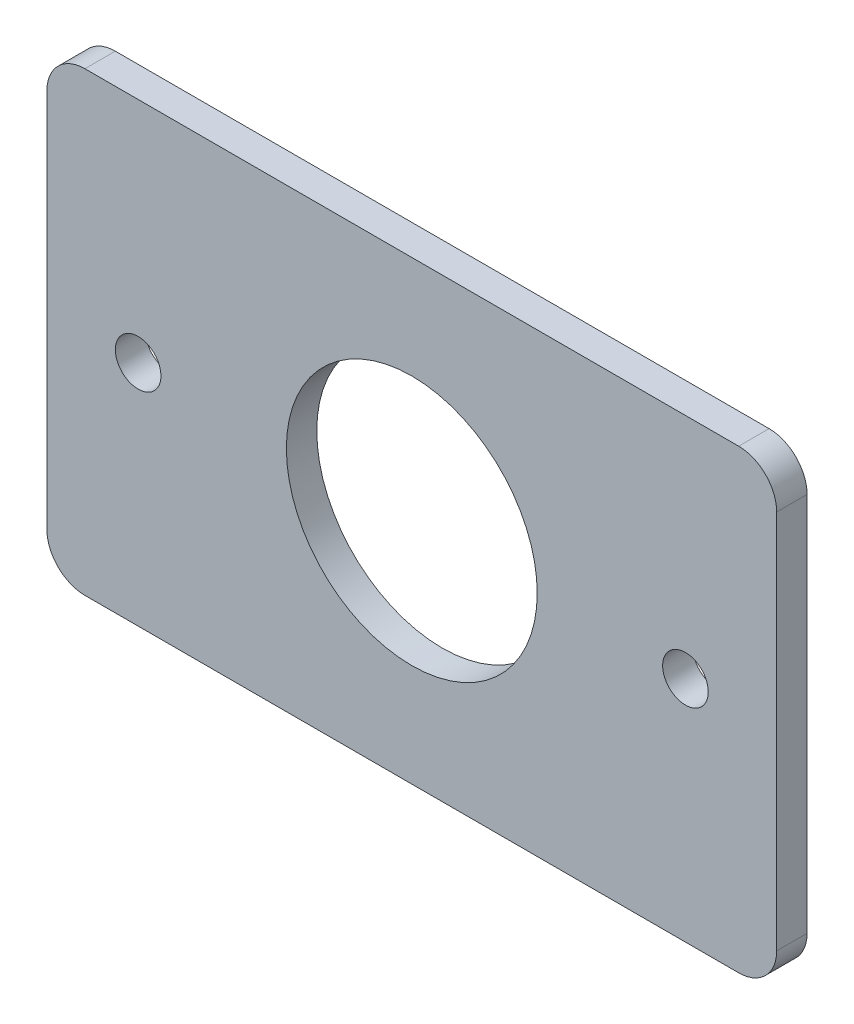
ISO-10303-21;
HEADER;
FILE_DESCRIPTION(('STEP AP214'),'2;1');
FILE_NAME('part.step','',(''),(''),'','','');
FILE_SCHEMA(('AUTOMOTIVE_DESIGN { 1 0 10303 214 1 1 1 1 }'));
ENDSEC;
DATA;
#1=APPLICATION_CONTEXT('core data for automotive mechanical design processes');
#2=APPLICATION_PROTOCOL_DEFINITION('international standard','automotive_design',2000,#1);
#3=PRODUCT_CONTEXT('',#1,'mechanical');
#4=PRODUCT('Part','Part','',(#3));
#5=PRODUCT_RELATED_PRODUCT_CATEGORY('part','',(#4));
#6=PRODUCT_DEFINITION_FORMATION('','',#4);
#7=PRODUCT_DEFINITION_CONTEXT('part definition',#1,'design');
#8=PRODUCT_DEFINITION('design','',#6,#7);
#9=PRODUCT_DEFINITION_SHAPE('','',#8);
#10=(LENGTH_UNIT() NAMED_UNIT(*) SI_UNIT(.MILLI.,.METRE.));
#11=(NAMED_UNIT(*) PLANE_ANGLE_UNIT() SI_UNIT($,.RADIAN.));
#12=(NAMED_UNIT(*) SI_UNIT($,.STERADIAN.) SOLID_ANGLE_UNIT());
#13=UNCERTAINTY_MEASURE_WITH_UNIT(LENGTH_MEASURE(1.E-05),#10,'distance_accuracy_value','');
#14=(GEOMETRIC_REPRESENTATION_CONTEXT(3) GLOBAL_UNCERTAINTY_ASSIGNED_CONTEXT((#13)) GLOBAL_UNIT_ASSIGNED_CONTEXT((#10,
#11,#12)) REPRESENTATION_CONTEXT('',''));
#15=CARTESIAN_POINT('',(0.,0.,0.));
#16=DIRECTION('',(0.,0.,1.));
#17=DIRECTION('',(1.,0.,0.));
#18=AXIS2_PLACEMENT_3D('',#15,#16,#17);
#19=CARTESIAN_POINT('',(-21.5,2.5,2.));
#20=DIRECTION('',(0.,0.,1.));
#21=DIRECTION('',(1.,0.,0.));
#22=AXIS2_PLACEMENT_3D('',#19,#20,#21);
#23=PLANE('',#22);
#24=CARTESIAN_POINT('',(-18.,15.,2.));
#25=DIRECTION('',(0.,0.,1.));
#26=DIRECTION('',(-1.,0.,0.));
#27=AXIS2_PLACEMENT_3D('',#24,#25,#26);
#28=CIRCLE('',#27,1.5);
#29=CARTESIAN_POINT('',(-19.5,15.,2.));
#30=VERTEX_POINT('',#29);
#31=EDGE_CURVE('E182',#30,#30,#28,.T.);
#32=ORIENTED_EDGE('',*,*,#31,.F.);
#33=EDGE_LOOP('',(#32));
#34=FACE_BOUND('',#33,.T.);
#35=CARTESIAN_POINT('',(-21.5,2.5,2.));
#36=DIRECTION('',(0.,0.,1.));
#37=DIRECTION('',(1.,0.,0.));
#38=AXIS2_PLACEMENT_3D('',#35,#36,#37);
#39=CIRCLE('',#38,2.5);
#40=CARTESIAN_POINT('',(-24.,2.5,2.));
#41=VERTEX_POINT('',#40);
#42=CARTESIAN_POINT('',(-21.5,0.,2.));
#43=VERTEX_POINT('',#42);
#44=EDGE_CURVE('E145',#41,#43,#39,.T.);
#45=ORIENTED_EDGE('',*,*,#44,.T.);
#46=DIRECTION('',(1.,0.,0.));
#47=VECTOR('',#46,1.);
#48=CARTESIAN_POINT('',(-21.5,0.,2.));
#49=LINE('',#48,#47);
#50=CARTESIAN_POINT('',(21.5,0.,2.));
#51=VERTEX_POINT('',#50);
#52=EDGE_CURVE('E93',#43,#51,#49,.T.);
#53=ORIENTED_EDGE('',*,*,#52,.T.);
#54=CARTESIAN_POINT('',(21.5,2.5,2.));
#55=DIRECTION('',(0.,0.,1.));
#56=DIRECTION('',(1.,0.,0.));
#57=AXIS2_PLACEMENT_3D('',#54,#55,#56);
#58=CIRCLE('',#57,2.5);
#59=CARTESIAN_POINT('',(24.,2.5,2.));
#60=VERTEX_POINT('',#59);
#61=EDGE_CURVE('E160',#51,#60,#58,.T.);
#62=ORIENTED_EDGE('',*,*,#61,.T.);
#63=DIRECTION('',(0.,1.,0.));
#64=VECTOR('',#63,1.);
#65=CARTESIAN_POINT('',(24.,27.5,2.));
#66=LINE('',#65,#64);
#67=CARTESIAN_POINT('',(24.,27.5,2.));
#68=VERTEX_POINT('',#67);
#69=EDGE_CURVE('E173',#60,#68,#66,.T.);
#70=ORIENTED_EDGE('',*,*,#69,.T.);
#71=CARTESIAN_POINT('',(21.5,27.5,2.));
#72=DIRECTION('',(0.,0.,1.));
#73=DIRECTION('',(1.,0.,0.));
#74=AXIS2_PLACEMENT_3D('',#71,#72,#73);
#75=CIRCLE('',#74,2.5);
#76=CARTESIAN_POINT('',(21.5,30.,2.));
#77=VERTEX_POINT('',#76);
#78=EDGE_CURVE('E112',#68,#77,#75,.T.);
#79=ORIENTED_EDGE('',*,*,#78,.T.);
#80=DIRECTION('',(-1.,0.,0.));
#81=VECTOR('',#80,1.);
#82=CARTESIAN_POINT('',(-21.5,30.,2.));
#83=LINE('',#82,#81);
#84=CARTESIAN_POINT('',(-21.5,30.,2.));
#85=VERTEX_POINT('',#84);
#86=EDGE_CURVE('E106',#77,#85,#83,.T.);
#87=ORIENTED_EDGE('',*,*,#86,.T.);
#88=CARTESIAN_POINT('',(-21.5,27.5,2.));
#89=DIRECTION('',(0.,0.,1.));
#90=DIRECTION('',(1.,0.,0.));
#91=AXIS2_PLACEMENT_3D('',#88,#89,#90);
#92=CIRCLE('',#91,2.5);
#93=CARTESIAN_POINT('',(-24.,27.5,2.));
#94=VERTEX_POINT('',#93);
#95=EDGE_CURVE('E110',#85,#94,#92,.T.);
#96=ORIENTED_EDGE('',*,*,#95,.T.);
#97=DIRECTION('',(0.,-1.,0.));
#98=VECTOR('',#97,1.);
#99=CARTESIAN_POINT('',(-24.,27.5,2.));
#100=LINE('',#99,#98);
#101=EDGE_CURVE('E50',#94,#41,#100,.T.);
#102=ORIENTED_EDGE('',*,*,#101,.T.);
#103=EDGE_LOOP('',(#45,#53,#62,#70,#79,#87,#96,#102));
#104=FACE_BOUND('',#103,.T.);
#105=CARTESIAN_POINT('',(18.,15.,2.));
#106=DIRECTION('',(0.,0.,1.));
#107=DIRECTION('',(1.,0.,0.));
#108=AXIS2_PLACEMENT_3D('',#105,#106,#107);
#109=CIRCLE('',#108,1.5);
#110=CARTESIAN_POINT('',(19.5,15.,2.));
#111=VERTEX_POINT('',#110);
#112=EDGE_CURVE('E134',#111,#111,#109,.T.);
#113=ORIENTED_EDGE('',*,*,#112,.F.);
#114=EDGE_LOOP('',(#113));
#115=FACE_BOUND('',#114,.T.);
#116=CARTESIAN_POINT('',(0.,15.,2.));
#117=DIRECTION('',(0.,0.,1.));
#118=DIRECTION('',(1.,0.,0.));
#119=AXIS2_PLACEMENT_3D('',#116,#117,#118);
#120=CIRCLE('',#119,8.25);
#121=CARTESIAN_POINT('',(8.25,15.,2.));
#122=VERTEX_POINT('',#121);
#123=EDGE_CURVE('E188',#122,#122,#120,.T.);
#124=ORIENTED_EDGE('',*,*,#123,.F.);
#125=EDGE_LOOP('',(#124));
#126=FACE_BOUND('',#125,.T.);
#127=ADVANCED_FACE('F33',(#34,#104,#115,#126),#23,.T.);
#128=CARTESIAN_POINT('',(-21.5,2.5,0.));
#129=DIRECTION('',(0.,0.,1.));
#130=DIRECTION('',(1.,0.,0.));
#131=AXIS2_PLACEMENT_3D('',#128,#129,#130);
#132=PLANE('',#131);
#133=CARTESIAN_POINT('',(-21.5,2.5,0.));
#134=DIRECTION('',(0.,0.,1.));
#135=DIRECTION('',(1.,0.,0.));
#136=AXIS2_PLACEMENT_3D('',#133,#134,#135);
#137=CIRCLE('',#136,2.5);
#138=CARTESIAN_POINT('',(-24.,2.5,0.));
#139=VERTEX_POINT('',#138);
#140=CARTESIAN_POINT('',(-21.5,0.,0.));
#141=VERTEX_POINT('',#140);
#142=EDGE_CURVE('E130',#139,#141,#137,.T.);
#143=ORIENTED_EDGE('',*,*,#142,.F.);
#144=DIRECTION('',(0.,-1.,0.));
#145=VECTOR('',#144,1.);
#146=CARTESIAN_POINT('',(-24.,27.5,0.));
#147=LINE('',#146,#145);
#148=CARTESIAN_POINT('',(-24.,27.5,0.));
#149=VERTEX_POINT('',#148);
#150=EDGE_CURVE('E85',#149,#139,#147,.T.);
#151=ORIENTED_EDGE('',*,*,#150,.F.);
#152=CARTESIAN_POINT('',(-21.5,27.5,0.));
#153=DIRECTION('',(0.,0.,1.));
#154=DIRECTION('',(1.,0.,0.));
#155=AXIS2_PLACEMENT_3D('',#152,#153,#154);
#156=CIRCLE('',#155,2.5);
#157=CARTESIAN_POINT('',(-21.5,30.,0.));
#158=VERTEX_POINT('',#157);
#159=EDGE_CURVE('E79',#158,#149,#156,.T.);
#160=ORIENTED_EDGE('',*,*,#159,.F.);
#161=DIRECTION('',(-1.,0.,0.));
#162=VECTOR('',#161,1.);
#163=CARTESIAN_POINT('',(-21.5,30.,0.));
#164=LINE('',#163,#162);
#165=CARTESIAN_POINT('',(21.5,30.,0.));
#166=VERTEX_POINT('',#165);
#167=EDGE_CURVE('E120',#166,#158,#164,.T.);
#168=ORIENTED_EDGE('',*,*,#167,.F.);
#169=CARTESIAN_POINT('',(21.5,27.5,0.));
#170=DIRECTION('',(0.,0.,1.));
#171=DIRECTION('',(1.,0.,0.));
#172=AXIS2_PLACEMENT_3D('',#169,#170,#171);
#173=CIRCLE('',#172,2.5);
#174=CARTESIAN_POINT('',(24.,27.5,0.));
#175=VERTEX_POINT('',#174);
#176=EDGE_CURVE('E140',#175,#166,#173,.T.);
#177=ORIENTED_EDGE('',*,*,#176,.F.);
#178=DIRECTION('',(0.,1.,0.));
#179=VECTOR('',#178,1.);
#180=CARTESIAN_POINT('',(24.,27.5,0.));
#181=LINE('',#180,#179);
#182=CARTESIAN_POINT('',(24.,2.5,0.));
#183=VERTEX_POINT('',#182);
#184=EDGE_CURVE('E138',#183,#175,#181,.T.);
#185=ORIENTED_EDGE('',*,*,#184,.F.);
#186=CARTESIAN_POINT('',(21.5,2.5,0.));
#187=DIRECTION('',(0.,0.,1.));
#188=DIRECTION('',(1.,0.,0.));
#189=AXIS2_PLACEMENT_3D('',#186,#187,#188);
#190=CIRCLE('',#189,2.5);
#191=CARTESIAN_POINT('',(21.5,0.,0.));
#192=VERTEX_POINT('',#191);
#193=EDGE_CURVE('E136',#192,#183,#190,.T.);
#194=ORIENTED_EDGE('',*,*,#193,.F.);
#195=DIRECTION('',(1.,0.,0.));
#196=VECTOR('',#195,1.);
#197=CARTESIAN_POINT('',(-21.5,0.,0.));
#198=LINE('',#197,#196);
#199=EDGE_CURVE('E133',#141,#192,#198,.T.);
#200=ORIENTED_EDGE('',*,*,#199,.F.);
#201=EDGE_LOOP('',(#143,#151,#160,#168,#177,#185,#194,#200));
#202=FACE_BOUND('',#201,.T.);
#203=CARTESIAN_POINT('',(18.,15.,0.));
#204=DIRECTION('',(0.,0.,1.));
#205=DIRECTION('',(1.,0.,0.));
#206=AXIS2_PLACEMENT_3D('',#203,#204,#205);
#207=CIRCLE('',#206,1.5);
#208=CARTESIAN_POINT('',(19.5,15.,0.));
#209=VERTEX_POINT('',#208);
#210=EDGE_CURVE('E179',#209,#209,#207,.T.);
#211=ORIENTED_EDGE('',*,*,#210,.T.);
#212=EDGE_LOOP('',(#211));
#213=FACE_BOUND('',#212,.T.);
#214=CARTESIAN_POINT('',(-18.,15.,0.));
#215=DIRECTION('',(0.,0.,1.));
#216=DIRECTION('',(-1.,0.,0.));
#217=AXIS2_PLACEMENT_3D('',#214,#215,#216);
#218=CIRCLE('',#217,1.5);
#219=CARTESIAN_POINT('',(-19.5,15.,0.));
#220=VERTEX_POINT('',#219);
#221=EDGE_CURVE('E185',#220,#220,#218,.T.);
#222=ORIENTED_EDGE('',*,*,#221,.T.);
#223=EDGE_LOOP('',(#222));
#224=FACE_BOUND('',#223,.T.);
#225=CARTESIAN_POINT('',(0.,15.,0.));
#226=DIRECTION('',(0.,0.,1.));
#227=DIRECTION('',(1.,0.,0.));
#228=AXIS2_PLACEMENT_3D('',#225,#226,#227);
#229=CIRCLE('',#228,8.25);
#230=CARTESIAN_POINT('',(8.25,15.,0.));
#231=VERTEX_POINT('',#230);
#232=EDGE_CURVE('E191',#231,#231,#229,.T.);
#233=ORIENTED_EDGE('',*,*,#232,.T.);
#234=EDGE_LOOP('',(#233));
#235=FACE_BOUND('',#234,.T.);
#236=ADVANCED_FACE('F164',(#202,#213,#224,#235),#132,.F.);
#237=CARTESIAN_POINT('',(-21.5,2.5,2.));
#238=DIRECTION('',(0.,0.,-1.));
#239=DIRECTION('',(-1.,0.,0.));
#240=AXIS2_PLACEMENT_3D('',#237,#238,#239);
#241=CYLINDRICAL_SURFACE('',#240,2.5);
#242=ORIENTED_EDGE('',*,*,#142,.T.);
#243=DIRECTION('',(0.,0.,-1.));
#244=VECTOR('',#243,1.);
#245=CARTESIAN_POINT('',(-21.5,0.,2.));
#246=LINE('',#245,#244);
#247=EDGE_CURVE('E11',#43,#141,#246,.T.);
#248=ORIENTED_EDGE('',*,*,#247,.F.);
#249=ORIENTED_EDGE('',*,*,#44,.F.);
#250=DIRECTION('',(0.,0.,-1.));
#251=VECTOR('',#250,1.);
#252=CARTESIAN_POINT('',(-24.,2.5,2.));
#253=LINE('',#252,#251);
#254=EDGE_CURVE('E126',#41,#139,#253,.T.);
#255=ORIENTED_EDGE('',*,*,#254,.T.);
#256=EDGE_LOOP('',(#242,#248,#249,#255));
#257=FACE_BOUND('',#256,.T.);
#258=ADVANCED_FACE('F35',(#257),#241,.T.);
#259=CARTESIAN_POINT('',(-21.5,0.,2.));
#260=DIRECTION('',(0.,1.,0.));
#261=DIRECTION('',(0.,0.,1.));
#262=AXIS2_PLACEMENT_3D('',#259,#260,#261);
#263=PLANE('',#262);
#264=ORIENTED_EDGE('',*,*,#199,.T.);
#265=DIRECTION('',(0.,0.,-1.));
#266=VECTOR('',#265,1.);
#267=CARTESIAN_POINT('',(21.5,0.,2.));
#268=LINE('',#267,#266);
#269=EDGE_CURVE('E42',#51,#192,#268,.T.);
#270=ORIENTED_EDGE('',*,*,#269,.F.);
#271=ORIENTED_EDGE('',*,*,#52,.F.);
#272=ORIENTED_EDGE('',*,*,#247,.T.);
#273=EDGE_LOOP('',(#264,#270,#271,#272));
#274=FACE_BOUND('',#273,.T.);
#275=ADVANCED_FACE('F224',(#274),#263,.F.);
#276=CARTESIAN_POINT('',(21.5,2.5,2.));
#277=DIRECTION('',(0.,0.,-1.));
#278=DIRECTION('',(-1.,0.,0.));
#279=AXIS2_PLACEMENT_3D('',#276,#277,#278);
#280=CYLINDRICAL_SURFACE('',#279,2.5);
#281=ORIENTED_EDGE('',*,*,#193,.T.);
#282=DIRECTION('',(0.,0.,-1.));
#283=VECTOR('',#282,1.);
#284=CARTESIAN_POINT('',(24.,2.5,2.));
#285=LINE('',#284,#283);
#286=EDGE_CURVE('E152',#60,#183,#285,.T.);
#287=ORIENTED_EDGE('',*,*,#286,.F.);
#288=ORIENTED_EDGE('',*,*,#61,.F.);
#289=ORIENTED_EDGE('',*,*,#269,.T.);
#290=EDGE_LOOP('',(#281,#287,#288,#289));
#291=FACE_BOUND('',#290,.T.);
#292=ADVANCED_FACE('F158',(#291),#280,.T.);
#293=CARTESIAN_POINT('',(24.,27.5,2.));
#294=DIRECTION('',(-1.,0.,0.));
#295=DIRECTION('',(0.,0.,1.));
#296=AXIS2_PLACEMENT_3D('',#293,#294,#295);
#297=PLANE('',#296);
#298=ORIENTED_EDGE('',*,*,#184,.T.);
#299=DIRECTION('',(0.,0.,-1.));
#300=VECTOR('',#299,1.);
#301=CARTESIAN_POINT('',(24.,27.5,2.));
#302=LINE('',#301,#300);
#303=EDGE_CURVE('E149',#68,#175,#302,.T.);
#304=ORIENTED_EDGE('',*,*,#303,.F.);
#305=ORIENTED_EDGE('',*,*,#69,.F.);
#306=ORIENTED_EDGE('',*,*,#286,.T.);
#307=EDGE_LOOP('',(#298,#304,#305,#306));
#308=FACE_BOUND('',#307,.T.);
#309=ADVANCED_FACE('F169',(#308),#297,.F.);
#310=CARTESIAN_POINT('',(21.5,27.5,2.));
#311=DIRECTION('',(0.,0.,-1.));
#312=DIRECTION('',(-1.,0.,0.));
#313=AXIS2_PLACEMENT_3D('',#310,#311,#312);
#314=CYLINDRICAL_SURFACE('',#313,2.5);
#315=ORIENTED_EDGE('',*,*,#176,.T.);
#316=DIRECTION('',(0.,0.,-1.));
#317=VECTOR('',#316,1.);
#318=CARTESIAN_POINT('',(21.5,30.,2.));
#319=LINE('',#318,#317);
#320=EDGE_CURVE('E121',#77,#166,#319,.T.);
#321=ORIENTED_EDGE('',*,*,#320,.F.);
#322=ORIENTED_EDGE('',*,*,#78,.F.);
#323=ORIENTED_EDGE('',*,*,#303,.T.);
#324=EDGE_LOOP('',(#315,#321,#322,#323));
#325=FACE_BOUND('',#324,.T.);
#326=ADVANCED_FACE('F172',(#325),#314,.T.);
#327=CARTESIAN_POINT('',(-21.5,30.,2.));
#328=DIRECTION('',(0.,-1.,0.));
#329=DIRECTION('',(0.,0.,-1.));
#330=AXIS2_PLACEMENT_3D('',#327,#328,#329);
#331=PLANE('',#330);
#332=ORIENTED_EDGE('',*,*,#167,.T.);
#333=DIRECTION('',(0.,0.,-1.));
#334=VECTOR('',#333,1.);
#335=CARTESIAN_POINT('',(-21.5,30.,2.));
#336=LINE('',#335,#334);
#337=EDGE_CURVE('E117',#85,#158,#336,.T.);
#338=ORIENTED_EDGE('',*,*,#337,.F.);
#339=ORIENTED_EDGE('',*,*,#86,.F.);
#340=ORIENTED_EDGE('',*,*,#320,.T.);
#341=EDGE_LOOP('',(#332,#338,#339,#340));
#342=FACE_BOUND('',#341,.T.);
#343=ADVANCED_FACE('F118',(#342),#331,.F.);
#344=CARTESIAN_POINT('',(-21.5,27.5,2.));
#345=DIRECTION('',(0.,0.,-1.));
#346=DIRECTION('',(-1.,0.,0.));
#347=AXIS2_PLACEMENT_3D('',#344,#345,#346);
#348=CYLINDRICAL_SURFACE('',#347,2.5);
#349=ORIENTED_EDGE('',*,*,#159,.T.);
#350=DIRECTION('',(0.,0.,-1.));
#351=VECTOR('',#350,1.);
#352=CARTESIAN_POINT('',(-24.,27.5,2.));
#353=LINE('',#352,#351);
#354=EDGE_CURVE('E122',#94,#149,#353,.T.);
#355=ORIENTED_EDGE('',*,*,#354,.F.);
#356=ORIENTED_EDGE('',*,*,#95,.F.);
#357=ORIENTED_EDGE('',*,*,#337,.T.);
#358=EDGE_LOOP('',(#349,#355,#356,#357));
#359=FACE_BOUND('',#358,.T.);
#360=ADVANCED_FACE('F124',(#359),#348,.T.);
#361=CARTESIAN_POINT('',(-24.,27.5,2.));
#362=DIRECTION('',(1.,0.,0.));
#363=DIRECTION('',(0.,0.,-1.));
#364=AXIS2_PLACEMENT_3D('',#361,#362,#363);
#365=PLANE('',#364);
#366=ORIENTED_EDGE('',*,*,#150,.T.);
#367=ORIENTED_EDGE('',*,*,#254,.F.);
#368=ORIENTED_EDGE('',*,*,#101,.F.);
#369=ORIENTED_EDGE('',*,*,#354,.T.);
#370=EDGE_LOOP('',(#366,#367,#368,#369));
#371=FACE_BOUND('',#370,.T.);
#372=ADVANCED_FACE('F212',(#371),#365,.F.);
#373=CARTESIAN_POINT('',(18.,15.,2.));
#374=DIRECTION('',(0.,0.,-1.));
#375=DIRECTION('',(-1.,0.,0.));
#376=AXIS2_PLACEMENT_3D('',#373,#374,#375);
#377=CYLINDRICAL_SURFACE('',#376,1.5);
#378=ORIENTED_EDGE('',*,*,#112,.T.);
#379=EDGE_LOOP('',(#378));
#380=FACE_BOUND('',#379,.T.);
#381=ORIENTED_EDGE('',*,*,#210,.F.);
#382=EDGE_LOOP('',(#381));
#383=FACE_BOUND('',#382,.T.);
#384=ADVANCED_FACE('F209',(#380,#383),#377,.F.);
#385=CARTESIAN_POINT('',(-18.,15.,2.));
#386=DIRECTION('',(0.,0.,-1.));
#387=DIRECTION('',(-1.,0.,0.));
#388=AXIS2_PLACEMENT_3D('',#385,#386,#387);
#389=CYLINDRICAL_SURFACE('',#388,1.5);
#390=ORIENTED_EDGE('',*,*,#31,.T.);
#391=EDGE_LOOP('',(#390));
#392=FACE_BOUND('',#391,.T.);
#393=ORIENTED_EDGE('',*,*,#221,.F.);
#394=EDGE_LOOP('',(#393));
#395=FACE_BOUND('',#394,.T.);
#396=ADVANCED_FACE('F288',(#392,#395),#389,.F.);
#397=CARTESIAN_POINT('',(0.,15.,2.));
#398=DIRECTION('',(0.,0.,-1.));
#399=DIRECTION('',(-1.,0.,0.));
#400=AXIS2_PLACEMENT_3D('',#397,#398,#399);
#401=CYLINDRICAL_SURFACE('',#400,8.25);
#402=ORIENTED_EDGE('',*,*,#123,.T.);
#403=EDGE_LOOP('',(#402));
#404=FACE_BOUND('',#403,.T.);
#405=ORIENTED_EDGE('',*,*,#232,.F.);
#406=EDGE_LOOP('',(#405));
#407=FACE_BOUND('',#406,.T.);
#408=ADVANCED_FACE('F197',(#404,#407),#401,.F.);
#409=CLOSED_SHELL('',(#127,#236,#258,#275,#292,#309,#326,#343,#360,#372,#384,#396,#408));
#410=MANIFOLD_SOLID_BREP('B2',#409);
#411=ADVANCED_BREP_SHAPE_REPRESENTATION('',(#18,#410),#14);
#412=SHAPE_DEFINITION_REPRESENTATION(#9,#411);
ENDSEC;
END-ISO-10303-21;
